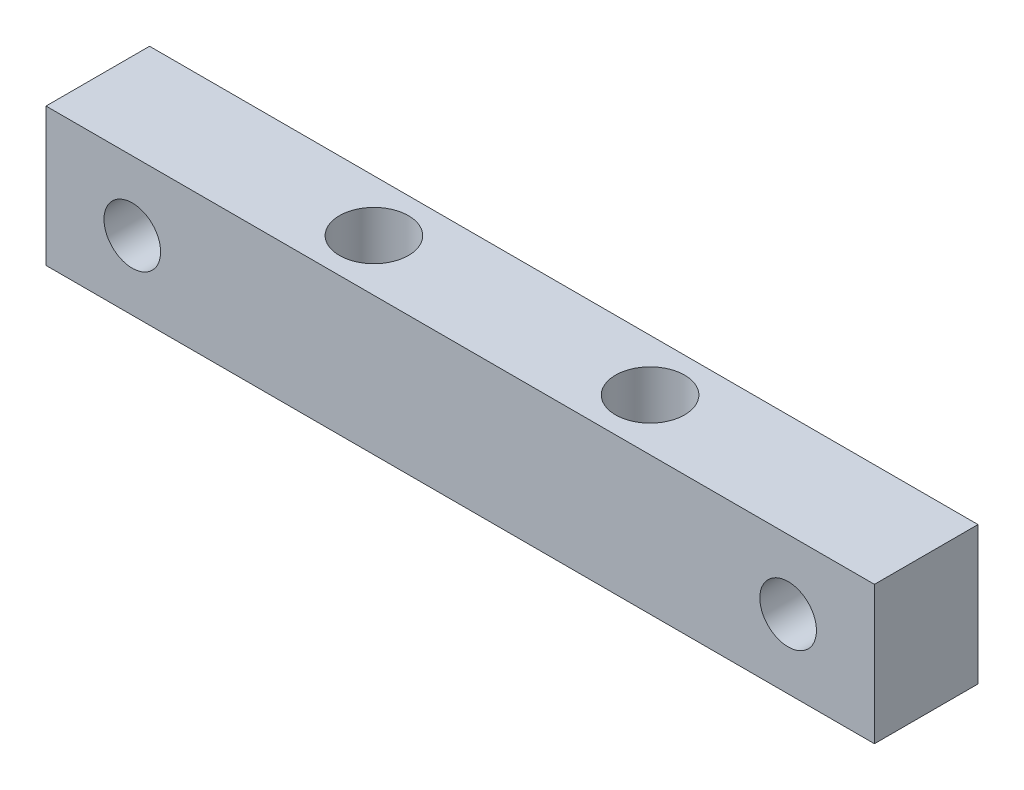
ISO-10303-21;
HEADER;
FILE_DESCRIPTION(('STEP AP214'),'2;1');
FILE_NAME('part.step','',(''),(''),'','','');
FILE_SCHEMA(('AUTOMOTIVE_DESIGN { 1 0 10303 214 1 1 1 1 }'));
ENDSEC;
DATA;
#1=APPLICATION_CONTEXT('core data for automotive mechanical design processes');
#2=APPLICATION_PROTOCOL_DEFINITION('international standard','automotive_design',2000,#1);
#3=PRODUCT_CONTEXT('',#1,'mechanical');
#4=PRODUCT('Part','Part','',(#3));
#5=PRODUCT_RELATED_PRODUCT_CATEGORY('part','',(#4));
#6=PRODUCT_DEFINITION_FORMATION('','',#4);
#7=PRODUCT_DEFINITION_CONTEXT('part definition',#1,'design');
#8=PRODUCT_DEFINITION('design','',#6,#7);
#9=PRODUCT_DEFINITION_SHAPE('','',#8);
#10=(LENGTH_UNIT() NAMED_UNIT(*) SI_UNIT(.MILLI.,.METRE.));
#11=(NAMED_UNIT(*) PLANE_ANGLE_UNIT() SI_UNIT($,.RADIAN.));
#12=(NAMED_UNIT(*) SI_UNIT($,.STERADIAN.) SOLID_ANGLE_UNIT());
#13=UNCERTAINTY_MEASURE_WITH_UNIT(LENGTH_MEASURE(1.E-05),#10,'distance_accuracy_value','');
#14=(GEOMETRIC_REPRESENTATION_CONTEXT(3) GLOBAL_UNCERTAINTY_ASSIGNED_CONTEXT((#13)) GLOBAL_UNIT_ASSIGNED_CONTEXT((#10,
#11,#12)) REPRESENTATION_CONTEXT('',''));
#15=CARTESIAN_POINT('',(0.,0.,0.));
#16=DIRECTION('',(0.,0.,1.));
#17=DIRECTION('',(1.,0.,0.));
#18=AXIS2_PLACEMENT_3D('',#15,#16,#17);
#19=CARTESIAN_POINT('',(0.,800.856140975981,0.));
#20=DIRECTION('',(0.,1.,0.));
#21=DIRECTION('',(0.,0.,1.));
#22=AXIS2_PLACEMENT_3D('',#19,#20,#21);
#23=PLANE('',#22);
#24=CARTESIAN_POINT('',(-12.7000000000132,800.856140975981,-58.7375));
#25=DIRECTION('',(0.,1.,0.));
#26=DIRECTION('',(0.,0.,1.));
#27=AXIS2_PLACEMENT_3D('',#24,#25,#26);
#28=CIRCLE('',#27,3.175);
#29=CARTESIAN_POINT('',(-12.7000000000132,800.856140975981,-55.5625));
#30=VERTEX_POINT('',#29);
#31=EDGE_CURVE('E100',#30,#30,#28,.T.);
#32=ORIENTED_EDGE('',*,*,#31,.F.);
#33=EDGE_LOOP('',(#32));
#34=FACE_BOUND('',#33,.T.);
#35=DIRECTION('',(0.,0.,1.));
#36=VECTOR('',#35,1.);
#37=CARTESIAN_POINT('',(-38.1000000000132,800.856140975981,-63.5));
#38=LINE('',#37,#36);
#39=CARTESIAN_POINT('',(-38.1000000000132,800.856140975981,-63.5));
#40=VERTEX_POINT('',#39);
#41=CARTESIAN_POINT('',(-38.1000000000132,800.856140975981,-53.975));
#42=VERTEX_POINT('',#41);
#43=EDGE_CURVE('E85',#40,#42,#38,.T.);
#44=ORIENTED_EDGE('',*,*,#43,.T.);
#45=DIRECTION('',(1.,0.,0.));
#46=VECTOR('',#45,1.);
#47=CARTESIAN_POINT('',(-38.1000000000132,800.856140975981,-53.975));
#48=LINE('',#47,#46);
#49=CARTESIAN_POINT('',(38.0999999999868,800.856140975981,-53.975));
#50=VERTEX_POINT('',#49);
#51=EDGE_CURVE('E80',#42,#50,#48,.T.);
#52=ORIENTED_EDGE('',*,*,#51,.T.);
#53=DIRECTION('',(0.,0.,-1.));
#54=VECTOR('',#53,1.);
#55=CARTESIAN_POINT('',(38.0999999999868,800.856140975981,-63.5));
#56=LINE('',#55,#54);
#57=CARTESIAN_POINT('',(38.0999999999868,800.856140975981,-63.5));
#58=VERTEX_POINT('',#57);
#59=EDGE_CURVE('E83',#50,#58,#56,.T.);
#60=ORIENTED_EDGE('',*,*,#59,.T.);
#61=DIRECTION('',(-1.,0.,0.));
#62=VECTOR('',#61,1.);
#63=CARTESIAN_POINT('',(-38.1000000000132,800.856140975981,-63.5));
#64=LINE('',#63,#62);
#65=EDGE_CURVE('E50',#58,#40,#64,.T.);
#66=ORIENTED_EDGE('',*,*,#65,.T.);
#67=EDGE_LOOP('',(#44,#52,#60,#66));
#68=FACE_BOUND('',#67,.T.);
#69=CARTESIAN_POINT('',(12.6999999999868,800.856140975981,-58.7375));
#70=DIRECTION('',(0.,1.,0.));
#71=DIRECTION('',(0.,0.,-1.));
#72=AXIS2_PLACEMENT_3D('',#69,#70,#71);
#73=CIRCLE('',#72,3.175);
#74=CARTESIAN_POINT('',(12.6999999999868,800.856140975981,-61.9125));
#75=VERTEX_POINT('',#74);
#76=EDGE_CURVE('E115',#75,#75,#73,.T.);
#77=ORIENTED_EDGE('',*,*,#76,.F.);
#78=EDGE_LOOP('',(#77));
#79=FACE_BOUND('',#78,.T.);
#80=ADVANCED_FACE('F33',(#34,#68,#79),#23,.T.);
#81=CARTESIAN_POINT('',(0.,788.156140975981,0.));
#82=DIRECTION('',(0.,1.,0.));
#83=DIRECTION('',(0.,0.,1.));
#84=AXIS2_PLACEMENT_3D('',#81,#82,#83);
#85=PLANE('',#84);
#86=DIRECTION('',(0.,0.,1.));
#87=VECTOR('',#86,1.);
#88=CARTESIAN_POINT('',(-38.1000000000132,788.156140975981,-63.5));
#89=LINE('',#88,#87);
#90=CARTESIAN_POINT('',(-38.1000000000132,788.156140975981,-63.5));
#91=VERTEX_POINT('',#90);
#92=CARTESIAN_POINT('',(-38.1000000000132,788.156140975981,-53.975));
#93=VERTEX_POINT('',#92);
#94=EDGE_CURVE('E97',#91,#93,#89,.T.);
#95=ORIENTED_EDGE('',*,*,#94,.F.);
#96=DIRECTION('',(-1.,0.,0.));
#97=VECTOR('',#96,1.);
#98=CARTESIAN_POINT('',(-38.1000000000132,788.156140975981,-63.5));
#99=LINE('',#98,#97);
#100=CARTESIAN_POINT('',(38.0999999999868,788.156140975981,-63.5));
#101=VERTEX_POINT('',#100);
#102=EDGE_CURVE('E73',#101,#91,#99,.T.);
#103=ORIENTED_EDGE('',*,*,#102,.F.);
#104=DIRECTION('',(0.,0.,-1.));
#105=VECTOR('',#104,1.);
#106=CARTESIAN_POINT('',(38.0999999999868,788.156140975981,-63.5));
#107=LINE('',#106,#105);
#108=CARTESIAN_POINT('',(38.0999999999868,788.156140975981,-53.975));
#109=VERTEX_POINT('',#108);
#110=EDGE_CURVE('E67',#109,#101,#107,.T.);
#111=ORIENTED_EDGE('',*,*,#110,.F.);
#112=DIRECTION('',(1.,0.,0.));
#113=VECTOR('',#112,1.);
#114=CARTESIAN_POINT('',(-38.1000000000132,788.156140975981,-53.975));
#115=LINE('',#114,#113);
#116=EDGE_CURVE('E89',#93,#109,#115,.T.);
#117=ORIENTED_EDGE('',*,*,#116,.F.);
#118=EDGE_LOOP('',(#95,#103,#111,#117));
#119=FACE_BOUND('',#118,.T.);
#120=CARTESIAN_POINT('',(-12.7000000000132,788.156140975981,-58.7375));
#121=DIRECTION('',(0.,1.,0.));
#122=DIRECTION('',(0.,0.,1.));
#123=AXIS2_PLACEMENT_3D('',#120,#121,#122);
#124=CIRCLE('',#123,3.175);
#125=CARTESIAN_POINT('',(-12.7000000000132,788.156140975981,-55.5625));
#126=VERTEX_POINT('',#125);
#127=EDGE_CURVE('E112',#126,#126,#124,.T.);
#128=ORIENTED_EDGE('',*,*,#127,.T.);
#129=EDGE_LOOP('',(#128));
#130=FACE_BOUND('',#129,.T.);
#131=CARTESIAN_POINT('',(12.6999999999868,788.156140975981,-58.7375));
#132=DIRECTION('',(0.,1.,0.));
#133=DIRECTION('',(0.,0.,-1.));
#134=AXIS2_PLACEMENT_3D('',#131,#132,#133);
#135=CIRCLE('',#134,3.175);
#136=CARTESIAN_POINT('',(12.6999999999868,788.156140975981,-61.9125));
#137=VERTEX_POINT('',#136);
#138=EDGE_CURVE('E118',#137,#137,#135,.T.);
#139=ORIENTED_EDGE('',*,*,#138,.T.);
#140=EDGE_LOOP('',(#139));
#141=FACE_BOUND('',#140,.T.);
#142=ADVANCED_FACE('F108',(#119,#130,#141),#85,.F.);
#143=CARTESIAN_POINT('',(-38.1000000000132,800.856140975981,-63.5));
#144=DIRECTION('',(1.,0.,0.));
#145=DIRECTION('',(0.,0.,-1.));
#146=AXIS2_PLACEMENT_3D('',#143,#144,#145);
#147=PLANE('',#146);
#148=ORIENTED_EDGE('',*,*,#94,.T.);
#149=DIRECTION('',(0.,-1.,0.));
#150=VECTOR('',#149,1.);
#151=CARTESIAN_POINT('',(-38.1000000000132,800.856140975981,-53.975));
#152=LINE('',#151,#150);
#153=EDGE_CURVE('E11',#42,#93,#152,.T.);
#154=ORIENTED_EDGE('',*,*,#153,.F.);
#155=ORIENTED_EDGE('',*,*,#43,.F.);
#156=DIRECTION('',(0.,-1.,0.));
#157=VECTOR('',#156,1.);
#158=CARTESIAN_POINT('',(-38.1000000000132,800.856140975981,-63.5));
#159=LINE('',#158,#157);
#160=EDGE_CURVE('E93',#40,#91,#159,.T.);
#161=ORIENTED_EDGE('',*,*,#160,.T.);
#162=EDGE_LOOP('',(#148,#154,#155,#161));
#163=FACE_BOUND('',#162,.T.);
#164=ADVANCED_FACE('F35',(#163),#147,.F.);
#165=CARTESIAN_POINT('',(-38.1000000000132,800.856140975981,-53.975));
#166=DIRECTION('',(0.,0.,-1.));
#167=DIRECTION('',(-1.,0.,0.));
#168=AXIS2_PLACEMENT_3D('',#165,#166,#167);
#169=PLANE('',#168);
#170=CARTESIAN_POINT('',(-30.1624999999868,794.506140975981,-53.975));
#171=DIRECTION('',(0.,0.,-1.));
#172=DIRECTION('',(-1.,0.,0.));
#173=AXIS2_PLACEMENT_3D('',#170,#171,#172);
#174=CIRCLE('',#173,2.60350000000001);
#175=CARTESIAN_POINT('',(-32.7659999999868,794.506140975981,-53.975));
#176=VERTEX_POINT('',#175);
#177=EDGE_CURVE('E121',#176,#176,#174,.F.);
#178=ORIENTED_EDGE('',*,*,#177,.F.);
#179=EDGE_LOOP('',(#178));
#180=FACE_BOUND('',#179,.T.);
#181=CARTESIAN_POINT('',(30.1624999999868,794.506140975981,-53.975));
#182=DIRECTION('',(0.,0.,-1.));
#183=DIRECTION('',(-1.,0.,0.));
#184=AXIS2_PLACEMENT_3D('',#181,#182,#183);
#185=CIRCLE('',#184,2.60350000000001);
#186=CARTESIAN_POINT('',(27.5589999999867,794.506140975981,-53.975));
#187=VERTEX_POINT('',#186);
#188=EDGE_CURVE('E124',#187,#187,#185,.F.);
#189=ORIENTED_EDGE('',*,*,#188,.F.);
#190=EDGE_LOOP('',(#189));
#191=FACE_BOUND('',#190,.T.);
#192=ORIENTED_EDGE('',*,*,#116,.T.);
#193=DIRECTION('',(0.,-1.,0.));
#194=VECTOR('',#193,1.);
#195=CARTESIAN_POINT('',(38.0999999999868,800.856140975981,-53.975));
#196=LINE('',#195,#194);
#197=EDGE_CURVE('E42',#50,#109,#196,.T.);
#198=ORIENTED_EDGE('',*,*,#197,.F.);
#199=ORIENTED_EDGE('',*,*,#51,.F.);
#200=ORIENTED_EDGE('',*,*,#153,.T.);
#201=EDGE_LOOP('',(#192,#198,#199,#200));
#202=FACE_BOUND('',#201,.T.);
#203=ADVANCED_FACE('F88',(#180,#191,#202),#169,.F.);
#204=CARTESIAN_POINT('',(38.0999999999868,800.856140975981,-63.5));
#205=DIRECTION('',(-1.,0.,0.));
#206=DIRECTION('',(0.,0.,1.));
#207=AXIS2_PLACEMENT_3D('',#204,#205,#206);
#208=PLANE('',#207);
#209=ORIENTED_EDGE('',*,*,#110,.T.);
#210=DIRECTION('',(0.,-1.,0.));
#211=VECTOR('',#210,1.);
#212=CARTESIAN_POINT('',(38.0999999999868,800.856140975981,-63.5));
#213=LINE('',#212,#211);
#214=EDGE_CURVE('E90',#58,#101,#213,.T.);
#215=ORIENTED_EDGE('',*,*,#214,.F.);
#216=ORIENTED_EDGE('',*,*,#59,.F.);
#217=ORIENTED_EDGE('',*,*,#197,.T.);
#218=EDGE_LOOP('',(#209,#215,#216,#217));
#219=FACE_BOUND('',#218,.T.);
#220=ADVANCED_FACE('F91',(#219),#208,.F.);
#221=CARTESIAN_POINT('',(-38.1000000000132,800.856140975981,-63.5));
#222=DIRECTION('',(0.,0.,1.));
#223=DIRECTION('',(1.,0.,0.));
#224=AXIS2_PLACEMENT_3D('',#221,#222,#223);
#225=PLANE('',#224);
#226=CARTESIAN_POINT('',(-30.1624999999868,794.506140975981,-63.5));
#227=DIRECTION('',(0.,0.,-1.));
#228=DIRECTION('',(-1.,0.,0.));
#229=AXIS2_PLACEMENT_3D('',#226,#227,#228);
#230=CIRCLE('',#229,2.60350000000001);
#231=CARTESIAN_POINT('',(-32.7659999999868,794.506140975981,-63.5));
#232=VERTEX_POINT('',#231);
#233=EDGE_CURVE('E127',#232,#232,#230,.T.);
#234=ORIENTED_EDGE('',*,*,#233,.F.);
#235=EDGE_LOOP('',(#234));
#236=FACE_BOUND('',#235,.T.);
#237=CARTESIAN_POINT('',(30.1624999999868,794.506140975981,-63.5));
#238=DIRECTION('',(0.,0.,-1.));
#239=DIRECTION('',(-1.,0.,0.));
#240=AXIS2_PLACEMENT_3D('',#237,#238,#239);
#241=CIRCLE('',#240,2.60350000000001);
#242=CARTESIAN_POINT('',(27.5589999999867,794.506140975981,-63.5));
#243=VERTEX_POINT('',#242);
#244=EDGE_CURVE('E128',#243,#243,#241,.T.);
#245=ORIENTED_EDGE('',*,*,#244,.F.);
#246=EDGE_LOOP('',(#245));
#247=FACE_BOUND('',#246,.T.);
#248=ORIENTED_EDGE('',*,*,#102,.T.);
#249=ORIENTED_EDGE('',*,*,#160,.F.);
#250=ORIENTED_EDGE('',*,*,#65,.F.);
#251=ORIENTED_EDGE('',*,*,#214,.T.);
#252=EDGE_LOOP('',(#248,#249,#250,#251));
#253=FACE_BOUND('',#252,.T.);
#254=ADVANCED_FACE('F105',(#236,#247,#253),#225,.F.);
#255=CARTESIAN_POINT('',(-12.7000000000132,800.856140975981,-58.7375));
#256=DIRECTION('',(0.,-1.,0.));
#257=DIRECTION('',(0.,0.,-1.));
#258=AXIS2_PLACEMENT_3D('',#255,#256,#257);
#259=CYLINDRICAL_SURFACE('',#258,3.175);
#260=ORIENTED_EDGE('',*,*,#31,.T.);
#261=EDGE_LOOP('',(#260));
#262=FACE_BOUND('',#261,.T.);
#263=ORIENTED_EDGE('',*,*,#127,.F.);
#264=EDGE_LOOP('',(#263));
#265=FACE_BOUND('',#264,.T.);
#266=ADVANCED_FACE('F141',(#262,#265),#259,.F.);
#267=CARTESIAN_POINT('',(12.6999999999868,800.856140975981,-58.7375));
#268=DIRECTION('',(0.,-1.,0.));
#269=DIRECTION('',(0.,0.,-1.));
#270=AXIS2_PLACEMENT_3D('',#267,#268,#269);
#271=CYLINDRICAL_SURFACE('',#270,3.175);
#272=ORIENTED_EDGE('',*,*,#76,.T.);
#273=EDGE_LOOP('',(#272));
#274=FACE_BOUND('',#273,.T.);
#275=ORIENTED_EDGE('',*,*,#138,.F.);
#276=EDGE_LOOP('',(#275));
#277=FACE_BOUND('',#276,.T.);
#278=ADVANCED_FACE('F148',(#274,#277),#271,.F.);
#279=CARTESIAN_POINT('',(30.1624999999868,794.506140975981,-53.974));
#280=DIRECTION('',(0.,0.,-1.));
#281=DIRECTION('',(-1.,0.,0.));
#282=AXIS2_PLACEMENT_3D('',#279,#280,#281);
#283=CYLINDRICAL_SURFACE('',#282,2.60350000000001);
#284=ORIENTED_EDGE('',*,*,#244,.T.);
#285=EDGE_LOOP('',(#284));
#286=FACE_BOUND('',#285,.T.);
#287=ORIENTED_EDGE('',*,*,#188,.T.);
#288=EDGE_LOOP('',(#287));
#289=FACE_BOUND('',#288,.T.);
#290=ADVANCED_FACE('F145',(#286,#289),#283,.F.);
#291=CARTESIAN_POINT('',(-30.1624999999868,794.506140975981,-53.974));
#292=DIRECTION('',(0.,0.,-1.));
#293=DIRECTION('',(-1.,0.,0.));
#294=AXIS2_PLACEMENT_3D('',#291,#292,#293);
#295=CYLINDRICAL_SURFACE('',#294,2.60350000000001);
#296=ORIENTED_EDGE('',*,*,#233,.T.);
#297=EDGE_LOOP('',(#296));
#298=FACE_BOUND('',#297,.T.);
#299=ORIENTED_EDGE('',*,*,#177,.T.);
#300=EDGE_LOOP('',(#299));
#301=FACE_BOUND('',#300,.T.);
#302=ADVANCED_FACE('F136',(#298,#301),#295,.F.);
#303=CLOSED_SHELL('',(#80,#142,#164,#203,#220,#254,#266,#278,#290,#302));
#304=MANIFOLD_SOLID_BREP('B2',#303);
#305=ADVANCED_BREP_SHAPE_REPRESENTATION('',(#18,#304),#14);
#306=SHAPE_DEFINITION_REPRESENTATION(#9,#305);
ENDSEC;
END-ISO-10303-21;
